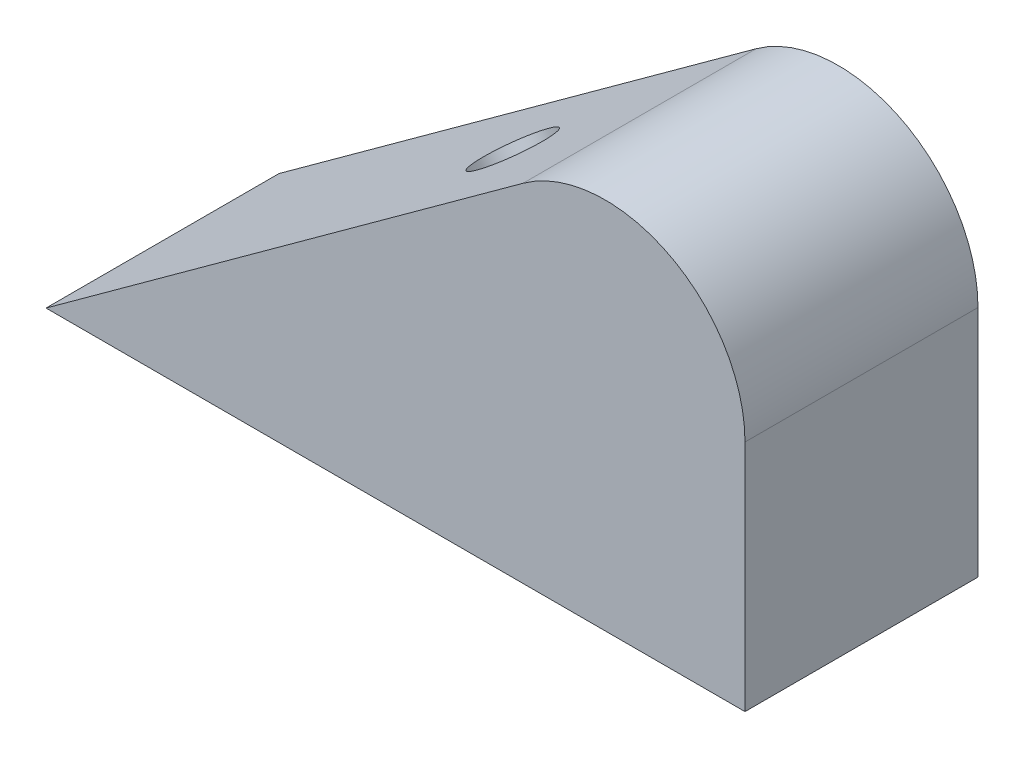
ISO-10303-21;
HEADER;
FILE_DESCRIPTION(('STEP AP214'),'2;1');
FILE_NAME('part.step','',(''),(''),'','','');
FILE_SCHEMA(('AUTOMOTIVE_DESIGN { 1 0 10303 214 1 1 1 1 }'));
ENDSEC;
DATA;
#1=APPLICATION_CONTEXT('core data for automotive mechanical design processes');
#2=APPLICATION_PROTOCOL_DEFINITION('international standard','automotive_design',2000,#1);
#3=PRODUCT_CONTEXT('',#1,'mechanical');
#4=PRODUCT('Part','Part','',(#3));
#5=PRODUCT_RELATED_PRODUCT_CATEGORY('part','',(#4));
#6=PRODUCT_DEFINITION_FORMATION('','',#4);
#7=PRODUCT_DEFINITION_CONTEXT('part definition',#1,'design');
#8=PRODUCT_DEFINITION('design','',#6,#7);
#9=PRODUCT_DEFINITION_SHAPE('','',#8);
#10=(LENGTH_UNIT() NAMED_UNIT(*) SI_UNIT(.MILLI.,.METRE.));
#11=(NAMED_UNIT(*) PLANE_ANGLE_UNIT() SI_UNIT($,.RADIAN.));
#12=(NAMED_UNIT(*) SI_UNIT($,.STERADIAN.) SOLID_ANGLE_UNIT());
#13=UNCERTAINTY_MEASURE_WITH_UNIT(LENGTH_MEASURE(1.E-05),#10,'distance_accuracy_value','');
#14=(GEOMETRIC_REPRESENTATION_CONTEXT(3) GLOBAL_UNCERTAINTY_ASSIGNED_CONTEXT((#13)) GLOBAL_UNIT_ASSIGNED_CONTEXT((#10,
#11,#12)) REPRESENTATION_CONTEXT('',''));
#15=CARTESIAN_POINT('',(0.,0.,0.));
#16=DIRECTION('',(0.,0.,1.));
#17=DIRECTION('',(1.,0.,0.));
#18=AXIS2_PLACEMENT_3D('',#15,#16,#17);
#19=CARTESIAN_POINT('',(5.87525019017302,0.,12.7));
#20=DIRECTION('',(0.,1.,0.));
#21=DIRECTION('',(-1.,0.,0.));
#22=AXIS2_PLACEMENT_3D('',#19,#20,#21);
#23=PLANE('',#22);
#24=CARTESIAN_POINT('',(-13.174749809827,0.,6.35));
#25=DIRECTION('',(0.,-1.,0.));
#26=DIRECTION('',(1.,0.,0.));
#27=AXIS2_PLACEMENT_3D('',#24,#25,#26);
#28=CIRCLE('',#27,2.5796875);
#29=CARTESIAN_POINT('',(-10.595062309827,0.,6.35));
#30=VERTEX_POINT('',#29);
#31=EDGE_CURVE('E123',#30,#30,#28,.T.);
#32=ORIENTED_EDGE('',*,*,#31,.F.);
#33=EDGE_LOOP('',(#32));
#34=FACE_BOUND('',#33,.T.);
#35=DIRECTION('',(1.,0.,0.));
#36=VECTOR('',#35,1.);
#37=CARTESIAN_POINT('',(5.87525019017302,0.,0.));
#38=LINE('',#37,#36);
#39=CARTESIAN_POINT('',(-32.224749809827,0.,0.));
#40=VERTEX_POINT('',#39);
#41=CARTESIAN_POINT('',(5.87525019017302,0.,0.));
#42=VERTEX_POINT('',#41);
#43=EDGE_CURVE('E99',#40,#42,#38,.T.);
#44=ORIENTED_EDGE('',*,*,#43,.T.);
#45=DIRECTION('',(0.,0.,-1.));
#46=VECTOR('',#45,1.);
#47=CARTESIAN_POINT('',(5.87525019017302,0.,12.7));
#48=LINE('',#47,#46);
#49=CARTESIAN_POINT('',(5.87525019017302,0.,12.7));
#50=VERTEX_POINT('',#49);
#51=EDGE_CURVE('E81',#50,#42,#48,.T.);
#52=ORIENTED_EDGE('',*,*,#51,.F.);
#53=DIRECTION('',(1.,0.,0.));
#54=VECTOR('',#53,1.);
#55=CARTESIAN_POINT('',(5.87525019017302,0.,12.7));
#56=LINE('',#55,#54);
#57=CARTESIAN_POINT('',(-32.224749809827,0.,12.7));
#58=VERTEX_POINT('',#57);
#59=EDGE_CURVE('E87',#58,#50,#56,.T.);
#60=ORIENTED_EDGE('',*,*,#59,.F.);
#61=DIRECTION('',(0.,0.,-1.));
#62=VECTOR('',#61,1.);
#63=CARTESIAN_POINT('',(-32.224749809827,0.,12.7));
#64=LINE('',#63,#62);
#65=EDGE_CURVE('E102',#58,#40,#64,.T.);
#66=ORIENTED_EDGE('',*,*,#65,.T.);
#67=EDGE_LOOP('',(#44,#52,#60,#66));
#68=FACE_BOUND('',#67,.T.);
#69=ADVANCED_FACE('F39',(#34,#68),#23,.F.);
#70=CARTESIAN_POINT('',(5.87525019017302,27.6812703170039,12.7));
#71=DIRECTION('',(-1.,0.,0.));
#72=DIRECTION('',(0.,0.,1.));
#73=AXIS2_PLACEMENT_3D('',#70,#71,#72);
#74=PLANE('',#73);
#75=DIRECTION('',(0.,1.,0.));
#76=VECTOR('',#75,1.);
#77=CARTESIAN_POINT('',(5.87525019017302,27.6812703170039,0.));
#78=LINE('',#77,#76);
#79=CARTESIAN_POINT('',(5.87525019017302,12.7261782650548,0.));
#80=VERTEX_POINT('',#79);
#81=EDGE_CURVE('E115',#42,#80,#78,.T.);
#82=ORIENTED_EDGE('',*,*,#81,.T.);
#83=DIRECTION('',(0.,0.,-1.));
#84=VECTOR('',#83,1.);
#85=CARTESIAN_POINT('',(5.87525019017302,12.7261782650548,12.7));
#86=LINE('',#85,#84);
#87=CARTESIAN_POINT('',(5.87525019017302,12.7261782650548,12.7));
#88=VERTEX_POINT('',#87);
#89=EDGE_CURVE('E48',#80,#88,#86,.F.);
#90=ORIENTED_EDGE('',*,*,#89,.T.);
#91=DIRECTION('',(0.,1.,0.));
#92=VECTOR('',#91,1.);
#93=CARTESIAN_POINT('',(5.87525019017302,27.6812703170039,12.7));
#94=LINE('',#93,#92);
#95=EDGE_CURVE('E77',#50,#88,#94,.T.);
#96=ORIENTED_EDGE('',*,*,#95,.F.);
#97=ORIENTED_EDGE('',*,*,#51,.T.);
#98=EDGE_LOOP('',(#82,#90,#96,#97));
#99=FACE_BOUND('',#98,.T.);
#100=ADVANCED_FACE('F79',(#99),#74,.F.);
#101=CARTESIAN_POINT('',(-32.224749809827,0.,12.7));
#102=DIRECTION('',(0.587785252292469,-0.809016994374951,0.));
#103=DIRECTION('',(0.809016994374951,0.587785252292469,0.));
#104=AXIS2_PLACEMENT_3D('',#101,#102,#103);
#105=PLANE('',#104);
#106=CARTESIAN_POINT('',(-13.1326040926664,13.8712558143924,6.35));
#107=DIRECTION('',(-0.587785252292469,0.809016994374951,0.));
#108=DIRECTION('',(-0.809016994374951,-0.587785252292469,0.));
#109=AXIS2_PLACEMENT_3D('',#106,#107,#108);
#110=CIRCLE('',#109,1.98437499999999);
#111=CARTESIAN_POINT('',(-14.7379971908792,12.7048694543745,6.35));
#112=VERTEX_POINT('',#111);
#113=EDGE_CURVE('E131',#112,#112,#110,.T.);
#114=ORIENTED_EDGE('',*,*,#113,.F.);
#115=EDGE_LOOP('',(#114));
#116=FACE_BOUND('',#115,.T.);
#117=DIRECTION('',(-0.809016994374951,-0.587785252292469,0.));
#118=VECTOR('',#117,1.);
#119=CARTESIAN_POINT('',(-32.224749809827,0.,12.7));
#120=LINE('',#119,#118);
#121=CARTESIAN_POINT('',(-6.22367343229559,18.8908877621919,12.7));
#122=VERTEX_POINT('',#121);
#123=EDGE_CURVE('E86',#122,#58,#120,.T.);
#124=ORIENTED_EDGE('',*,*,#123,.F.);
#125=DIRECTION('',(0.,0.,-1.));
#126=VECTOR('',#125,1.);
#127=CARTESIAN_POINT('',(-6.22367343229559,18.8908877621919,12.7));
#128=LINE('',#127,#126);
#129=CARTESIAN_POINT('',(-6.22367343229559,18.8908877621919,0.));
#130=VERTEX_POINT('',#129);
#131=EDGE_CURVE('E101',#122,#130,#128,.T.);
#132=ORIENTED_EDGE('',*,*,#131,.T.);
#133=DIRECTION('',(-0.809016994374951,-0.587785252292469,0.));
#134=VECTOR('',#133,1.);
#135=CARTESIAN_POINT('',(-32.224749809827,0.,0.));
#136=LINE('',#135,#134);
#137=EDGE_CURVE('E96',#130,#40,#136,.T.);
#138=ORIENTED_EDGE('',*,*,#137,.T.);
#139=ORIENTED_EDGE('',*,*,#65,.F.);
#140=EDGE_LOOP('',(#124,#132,#138,#139));
#141=FACE_BOUND('',#140,.T.);
#142=ADVANCED_FACE('F148',(#116,#141),#105,.F.);
#143=CARTESIAN_POINT('',(0.,0.,12.7));
#144=DIRECTION('',(0.,0.,1.));
#145=DIRECTION('',(1.,0.,0.));
#146=AXIS2_PLACEMENT_3D('',#143,#144,#145);
#147=PLANE('',#146);
#148=ORIENTED_EDGE('',*,*,#95,.T.);
#149=CARTESIAN_POINT('',(-1.74474980982698,12.7261782650548,12.7));
#150=DIRECTION('',(0.,0.,1.));
#151=DIRECTION('',(1.,0.,0.));
#152=AXIS2_PLACEMENT_3D('',#149,#150,#151);
#153=CIRCLE('',#152,7.62);
#154=EDGE_CURVE('E11',#88,#122,#153,.T.);
#155=ORIENTED_EDGE('',*,*,#154,.T.);
#156=ORIENTED_EDGE('',*,*,#123,.T.);
#157=ORIENTED_EDGE('',*,*,#59,.T.);
#158=EDGE_LOOP('',(#148,#155,#156,#157));
#159=FACE_BOUND('',#158,.T.);
#160=ADVANCED_FACE('F90',(#159),#147,.T.);
#161=CARTESIAN_POINT('',(0.,0.,0.));
#162=DIRECTION('',(0.,0.,1.));
#163=DIRECTION('',(1.,0.,0.));
#164=AXIS2_PLACEMENT_3D('',#161,#162,#163);
#165=PLANE('',#164);
#166=ORIENTED_EDGE('',*,*,#137,.F.);
#167=CARTESIAN_POINT('',(-1.74474980982698,12.7261782650548,0.));
#168=DIRECTION('',(0.,0.,1.));
#169=DIRECTION('',(1.,0.,0.));
#170=AXIS2_PLACEMENT_3D('',#167,#168,#169);
#171=CIRCLE('',#170,7.62);
#172=EDGE_CURVE('E62',#130,#80,#171,.F.);
#173=ORIENTED_EDGE('',*,*,#172,.T.);
#174=ORIENTED_EDGE('',*,*,#81,.F.);
#175=ORIENTED_EDGE('',*,*,#43,.F.);
#176=EDGE_LOOP('',(#166,#173,#174,#175));
#177=FACE_BOUND('',#176,.T.);
#178=ADVANCED_FACE('F167',(#177),#165,.F.);
#179=CARTESIAN_POINT('',(-13.174749809827,5.08,6.35));
#180=DIRECTION('',(0.,-1.,0.));
#181=DIRECTION('',(1.,0.,0.));
#182=AXIS2_PLACEMENT_3D('',#179,#180,#181);
#183=CYLINDRICAL_SURFACE('',#182,2.5796875);
#184=CARTESIAN_POINT('',(-13.174749809827,5.08,6.35));
#185=DIRECTION('',(0.,-1.,0.));
#186=DIRECTION('',(1.,0.,0.));
#187=AXIS2_PLACEMENT_3D('',#184,#185,#186);
#188=CIRCLE('',#187,2.5796875);
#189=CARTESIAN_POINT('',(-10.595062309827,5.08,6.35));
#190=VERTEX_POINT('',#189);
#191=EDGE_CURVE('E120',#190,#190,#188,.T.);
#192=ORIENTED_EDGE('',*,*,#191,.F.);
#193=EDGE_LOOP('',(#192));
#194=FACE_BOUND('',#193,.T.);
#195=ORIENTED_EDGE('',*,*,#31,.T.);
#196=EDGE_LOOP('',(#195));
#197=FACE_BOUND('',#196,.T.);
#198=ADVANCED_FACE('F170',(#194,#197),#183,.F.);
#199=CARTESIAN_POINT('',(-13.174749809827,5.08,6.35));
#200=DIRECTION('',(0.,-1.,0.));
#201=DIRECTION('',(1.,0.,0.));
#202=AXIS2_PLACEMENT_3D('',#199,#200,#201);
#203=PLANE('',#202);
#204=ORIENTED_EDGE('',*,*,#191,.T.);
#205=EDGE_LOOP('',(#204));
#206=FACE_BOUND('',#205,.T.);
#207=ADVANCED_FACE('F144',(#206),#203,.T.);
#208=CARTESIAN_POINT('',(-10.1466550110207,9.76144948296763,6.35));
#209=DIRECTION('',(-0.587785252292469,0.809016994374951,0.));
#210=DIRECTION('',(-0.809016994374951,-0.587785252292469,0.));
#211=AXIS2_PLACEMENT_3D('',#208,#209,#210);
#212=CYLINDRICAL_SURFACE('',#211,1.98437499999999);
#213=CARTESIAN_POINT('',(-10.1466550110207,9.76144948296763,6.35));
#214=DIRECTION('',(-0.587785252292469,0.809016994374951,0.));
#215=DIRECTION('',(-0.809016994374951,-0.587785252292469,0.));
#216=AXIS2_PLACEMENT_3D('',#213,#214,#215);
#217=CIRCLE('',#216,1.98437499999999);
#218=CARTESIAN_POINT('',(-11.7520481092335,8.59506312294976,6.35));
#219=VERTEX_POINT('',#218);
#220=EDGE_CURVE('E127',#219,#219,#217,.T.);
#221=CARTESIAN_POINT('',(-11.7520481092335,8.59506312294976,6.35));
#222=CARTESIAN_POINT('',(-11.7831517455006,8.63787360556877,6.35));
#223=CARTESIAN_POINT('',(-11.8142553817678,8.68068408818778,6.35));
#224=CARTESIAN_POINT('',(-11.8764626543021,8.76630505342579,6.35));
#225=CARTESIAN_POINT('',(-11.9075662905692,8.8091155360448,6.35));
#226=CARTESIAN_POINT('',(-11.9697735631035,8.89473650128282,6.35));
#227=CARTESIAN_POINT('',(-12.0008771993706,8.93754698390183,6.35));
#228=CARTESIAN_POINT('',(-12.0630844719049,9.02316794913984,6.35));
#229=CARTESIAN_POINT('',(-12.0941881081721,9.06597843175885,6.35));
#230=CARTESIAN_POINT('',(-12.1563953807064,9.15159939699687,6.35));
#231=CARTESIAN_POINT('',(-12.1874990169735,9.19440987961587,6.35));
#232=CARTESIAN_POINT('',(-12.2497062895078,9.28003084485389,6.35));
#233=CARTESIAN_POINT('',(-12.2808099257749,9.3228413274729,6.35));
#234=CARTESIAN_POINT('',(-12.3430171983092,9.40846229271091,6.35));
#235=CARTESIAN_POINT('',(-12.3741208345764,9.45127277532992,6.35));
#236=CARTESIAN_POINT('',(-12.4363281071106,9.53689374056794,6.35));
#237=CARTESIAN_POINT('',(-12.4674317433778,9.57970422318694,6.35));
#238=CARTESIAN_POINT('',(-12.5296390159121,9.66532518842496,6.35));
#239=CARTESIAN_POINT('',(-12.5607426521792,9.70813567104397,6.35));
#240=CARTESIAN_POINT('',(-12.6229499247135,9.79375663628198,6.35));
#241=CARTESIAN_POINT('',(-12.6540535609806,9.83656711890099,6.35));
#242=CARTESIAN_POINT('',(-12.7162608335149,9.92218808413901,6.35));
#243=CARTESIAN_POINT('',(-12.7473644697821,9.96499856675801,6.35));
#244=CARTESIAN_POINT('',(-12.8095717423164,10.050619531996,6.35));
#245=CARTESIAN_POINT('',(-12.8406753785835,10.093430014615,6.35));
#246=CARTESIAN_POINT('',(-12.9028826511178,10.1790509798531,6.35));
#247=CARTESIAN_POINT('',(-12.9339862873849,10.2218614624721,6.35));
#248=CARTESIAN_POINT('',(-12.9961935599192,10.3074824277101,6.35));
#249=CARTESIAN_POINT('',(-13.0272971961864,10.3502929103291,6.35));
#250=CARTESIAN_POINT('',(-13.0895044687206,10.4359138755671,6.35));
#251=CARTESIAN_POINT('',(-13.1206081049878,10.4787243581861,6.35));
#252=CARTESIAN_POINT('',(-13.1828153775221,10.5643453234241,6.35));
#253=CARTESIAN_POINT('',(-13.2139190137892,10.6071558060431,6.35));
#254=CARTESIAN_POINT('',(-13.2761262863235,10.6927767712811,6.35));
#255=CARTESIAN_POINT('',(-13.3072299225907,10.7355872539002,6.35));
#256=CARTESIAN_POINT('',(-13.3694371951249,10.8212082191382,6.35));
#257=CARTESIAN_POINT('',(-13.4005408313921,10.8640187017572,6.35));
#258=CARTESIAN_POINT('',(-13.4627481039264,10.9496396669952,6.35));
#259=CARTESIAN_POINT('',(-13.4938517401935,10.9924501496142,6.35));
#260=CARTESIAN_POINT('',(-13.5560590127278,11.0780711148522,6.35));
#261=CARTESIAN_POINT('',(-13.5871626489949,11.1208815974712,6.35));
#262=CARTESIAN_POINT('',(-13.6493699215292,11.2065025627092,6.35));
#263=CARTESIAN_POINT('',(-13.6804735577964,11.2493130453282,6.35));
#264=CARTESIAN_POINT('',(-13.7426808303307,11.3349340105663,6.35));
#265=CARTESIAN_POINT('',(-13.7737844665978,11.3777444931853,6.35));
#266=CARTESIAN_POINT('',(-13.8359917391321,11.4633654584233,6.35));
#267=CARTESIAN_POINT('',(-13.8670953753992,11.5061759410423,6.35));
#268=CARTESIAN_POINT('',(-13.9293026479335,11.5917969062803,6.35));
#269=CARTESIAN_POINT('',(-13.9604062842007,11.6346073888993,6.35));
#270=CARTESIAN_POINT('',(-14.0226135567349,11.7202283541373,6.35));
#271=CARTESIAN_POINT('',(-14.0537171930021,11.7630388367563,6.35));
#272=CARTESIAN_POINT('',(-14.1159244655364,11.8486598019944,6.35));
#273=CARTESIAN_POINT('',(-14.1470281018035,11.8914702846134,6.35));
#274=CARTESIAN_POINT('',(-14.2092353743378,11.9770912498514,6.35));
#275=CARTESIAN_POINT('',(-14.2403390106049,12.0199017324704,6.35));
#276=CARTESIAN_POINT('',(-14.3025462831392,12.1055226977084,6.35));
#277=CARTESIAN_POINT('',(-14.3336499194064,12.1483331803274,6.35));
#278=CARTESIAN_POINT('',(-14.3958571919407,12.2339541455654,6.35));
#279=CARTESIAN_POINT('',(-14.4269608282078,12.2767646281844,6.35));
#280=CARTESIAN_POINT('',(-14.4891681007421,12.3623855934225,6.35));
#281=CARTESIAN_POINT('',(-14.5202717370092,12.4051960760415,6.35));
#282=CARTESIAN_POINT('',(-14.5824790095435,12.4908170412795,6.35));
#283=CARTESIAN_POINT('',(-14.6135826458107,12.5336275238985,6.35));
#284=CARTESIAN_POINT('',(-14.6757899183449,12.6192484891365,6.35));
#285=CARTESIAN_POINT('',(-14.7068935546121,12.6620589717555,6.35));
#286=CARTESIAN_POINT('',(-14.7379971908792,12.7048694543745,6.35));
#287=B_SPLINE_CURVE_WITH_KNOTS('',3,(#221,#222,#223,#224,#225,#226,#227,#228,#229,#230,#231,
#232,#233,#234,#235,#236,#237,#238,#239,#240,#241,#242,#243,#244,#245,#246,#247,#248,#249,#250,
#251,#252,#253,#254,#255,#256,#257,#258,#259,#260,#261,#262,#263,#264,#265,#266,#267,#268,#269,
#270,#271,#272,#273,#274,#275,#276,#277,#278,#279,#280,#281,#282,#283,#284,#285,#286),
.UNSPECIFIED.,.F.,.F.,(4,2,2,2,2,2,2,2,2,2,2,2,2,2,2,2,2,2,2,2,2,2,2,2,2,2,2,2,2,2,2,2,4),(0.,
0.15875,0.317500000000001,0.47625,0.635,0.793750000000001,0.952499999999999,1.11125,1.27,
1.42875,1.5875,1.74625,1.905,2.06375,2.2225,2.38125,2.54,2.69875,2.8575,3.01625,3.175,3.33375,
3.4925,3.65125,3.81,3.96875,4.1275,4.28625,4.445,4.60375,4.7625,4.92125,5.08),.UNSPECIFIED.);
#288=EDGE_CURVE('BSEAM141',#219,#112,#287,.T.);
#289=ORIENTED_EDGE('',*,*,#220,.F.);
#290=ORIENTED_EDGE('',*,*,#113,.T.);
#291=ORIENTED_EDGE('',*,*,#288,.T.);
#292=ORIENTED_EDGE('',*,*,#288,.F.);
#293=EDGE_LOOP('',(#289,#291,#290,#292));
#294=FACE_BOUND('',#293,.T.);
#295=ADVANCED_FACE('F141',(#294),#212,.F.);
#296=CARTESIAN_POINT('',(-10.1466550110207,9.76144948296763,6.35));
#297=DIRECTION('',(-0.587785252292469,0.809016994374951,0.));
#298=DIRECTION('',(-0.809016994374951,-0.587785252292469,0.));
#299=AXIS2_PLACEMENT_3D('',#296,#297,#298);
#300=PLANE('',#299);
#301=ORIENTED_EDGE('',*,*,#220,.T.);
#302=EDGE_LOOP('',(#301));
#303=FACE_BOUND('',#302,.T.);
#304=ADVANCED_FACE('F139',(#303),#300,.T.);
#305=CARTESIAN_POINT('',(-1.74474980982698,12.7261782650548,12.7));
#306=DIRECTION('',(0.,0.,-1.));
#307=DIRECTION('',(-1.,0.,0.));
#308=AXIS2_PLACEMENT_3D('',#305,#306,#307);
#309=CYLINDRICAL_SURFACE('',#308,7.62);
#310=ORIENTED_EDGE('',*,*,#154,.F.);
#311=ORIENTED_EDGE('',*,*,#89,.F.);
#312=ORIENTED_EDGE('',*,*,#172,.F.);
#313=ORIENTED_EDGE('',*,*,#131,.F.);
#314=EDGE_LOOP('',(#310,#311,#312,#313));
#315=FACE_BOUND('',#314,.T.);
#316=ADVANCED_FACE('F41',(#315),#309,.T.);
#317=CLOSED_SHELL('',(#69,#100,#142,#160,#178,#198,#207,#295,#304,#316));
#318=MANIFOLD_SOLID_BREP('B2',#317);
#319=ADVANCED_BREP_SHAPE_REPRESENTATION('',(#18,#318),#14);
#320=SHAPE_DEFINITION_REPRESENTATION(#9,#319);
ENDSEC;
END-ISO-10303-21;
